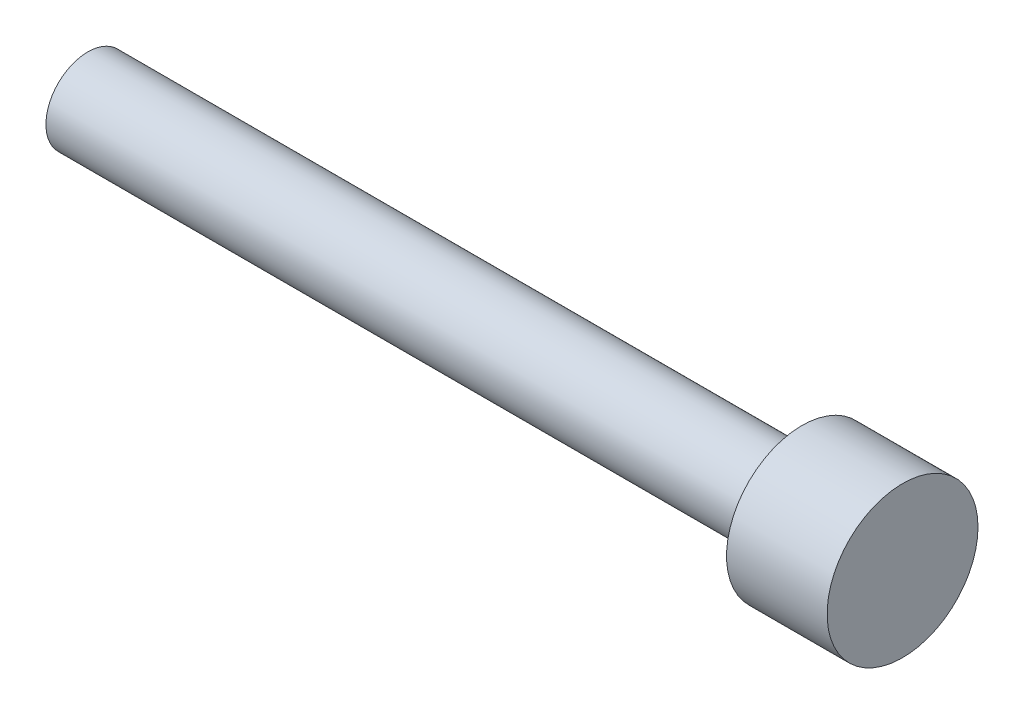
ISO-10303-21;
HEADER;
FILE_DESCRIPTION(('STEP AP214'),'2;1');
FILE_NAME('part.step','',(''),(''),'','','');
FILE_SCHEMA(('AUTOMOTIVE_DESIGN { 1 0 10303 214 1 1 1 1 }'));
ENDSEC;
DATA;
#1=APPLICATION_CONTEXT('core data for automotive mechanical design processes');
#2=APPLICATION_PROTOCOL_DEFINITION('international standard','automotive_design',2000,#1);
#3=PRODUCT_CONTEXT('',#1,'mechanical');
#4=PRODUCT('Part','Part','',(#3));
#5=PRODUCT_RELATED_PRODUCT_CATEGORY('part','',(#4));
#6=PRODUCT_DEFINITION_FORMATION('','',#4);
#7=PRODUCT_DEFINITION_CONTEXT('part definition',#1,'design');
#8=PRODUCT_DEFINITION('design','',#6,#7);
#9=PRODUCT_DEFINITION_SHAPE('','',#8);
#10=(LENGTH_UNIT() NAMED_UNIT(*) SI_UNIT(.MILLI.,.METRE.));
#11=(NAMED_UNIT(*) PLANE_ANGLE_UNIT() SI_UNIT($,.RADIAN.));
#12=(NAMED_UNIT(*) SI_UNIT($,.STERADIAN.) SOLID_ANGLE_UNIT());
#13=UNCERTAINTY_MEASURE_WITH_UNIT(LENGTH_MEASURE(1.E-05),#10,'distance_accuracy_value','');
#14=(GEOMETRIC_REPRESENTATION_CONTEXT(3) GLOBAL_UNCERTAINTY_ASSIGNED_CONTEXT((#13)) GLOBAL_UNIT_ASSIGNED_CONTEXT((#10,
#11,#12)) REPRESENTATION_CONTEXT('',''));
#15=CARTESIAN_POINT('',(0.,0.,0.));
#16=DIRECTION('',(0.,0.,1.));
#17=DIRECTION('',(1.,0.,0.));
#18=AXIS2_PLACEMENT_3D('',#15,#16,#17);
#19=CARTESIAN_POINT('',(10.65,0.,0.));
#20=DIRECTION('',(-1.,0.,0.));
#21=DIRECTION('',(0.,0.,1.));
#22=AXIS2_PLACEMENT_3D('',#19,#20,#21);
#23=CYLINDRICAL_SURFACE('',#22,1.25);
#24=CARTESIAN_POINT('',(10.65,0.,0.));
#25=DIRECTION('',(1.,0.,0.));
#26=DIRECTION('',(0.,0.,-1.));
#27=AXIS2_PLACEMENT_3D('',#24,#25,#26);
#28=CIRCLE('',#27,1.25);
#29=CARTESIAN_POINT('',(10.65,0.,-1.25));
#30=VERTEX_POINT('',#29);
#31=EDGE_CURVE('E10',#30,#30,#28,.T.);
#32=ORIENTED_EDGE('',*,*,#31,.F.);
#33=EDGE_LOOP('',(#32));
#34=FACE_BOUND('',#33,.T.);
#35=CARTESIAN_POINT('',(-10.65,0.,0.));
#36=DIRECTION('',(1.,0.,0.));
#37=DIRECTION('',(0.,0.,-1.));
#38=AXIS2_PLACEMENT_3D('',#35,#36,#37);
#39=CIRCLE('',#38,1.25);
#40=CARTESIAN_POINT('',(-10.65,0.,-1.25));
#41=VERTEX_POINT('',#40);
#42=EDGE_CURVE('E33',#41,#41,#39,.T.);
#43=ORIENTED_EDGE('',*,*,#42,.T.);
#44=EDGE_LOOP('',(#43));
#45=FACE_BOUND('',#44,.T.);
#46=ADVANCED_FACE('F30',(#34,#45),#23,.T.);
#47=CARTESIAN_POINT('',(-10.65,0.,0.));
#48=DIRECTION('',(1.,0.,0.));
#49=DIRECTION('',(0.,0.,-1.));
#50=AXIS2_PLACEMENT_3D('',#47,#48,#49);
#51=PLANE('',#50);
#52=ORIENTED_EDGE('',*,*,#42,.F.);
#53=EDGE_LOOP('',(#52));
#54=FACE_BOUND('',#53,.T.);
#55=ADVANCED_FACE('F53',(#54),#51,.F.);
#56=CARTESIAN_POINT('',(13.65,0.,0.));
#57=DIRECTION('',(-1.,0.,0.));
#58=DIRECTION('',(0.,0.,1.));
#59=AXIS2_PLACEMENT_3D('',#56,#57,#58);
#60=CYLINDRICAL_SURFACE('',#59,2.25);
#61=CARTESIAN_POINT('',(13.65,0.,0.));
#62=DIRECTION('',(1.,0.,0.));
#63=DIRECTION('',(0.,0.,-1.));
#64=AXIS2_PLACEMENT_3D('',#61,#62,#63);
#65=CIRCLE('',#64,2.25);
#66=CARTESIAN_POINT('',(13.65,0.,-2.25));
#67=VERTEX_POINT('',#66);
#68=EDGE_CURVE('E40',#67,#67,#65,.T.);
#69=ORIENTED_EDGE('',*,*,#68,.F.);
#70=EDGE_LOOP('',(#69));
#71=FACE_BOUND('',#70,.T.);
#72=CARTESIAN_POINT('',(10.65,0.,0.));
#73=DIRECTION('',(1.,0.,0.));
#74=DIRECTION('',(0.,0.,-1.));
#75=AXIS2_PLACEMENT_3D('',#72,#73,#74);
#76=CIRCLE('',#75,2.25);
#77=CARTESIAN_POINT('',(10.65,0.,-2.25));
#78=VERTEX_POINT('',#77);
#79=EDGE_CURVE('E42',#78,#78,#76,.T.);
#80=ORIENTED_EDGE('',*,*,#79,.T.);
#81=EDGE_LOOP('',(#80));
#82=FACE_BOUND('',#81,.T.);
#83=ADVANCED_FACE('F50',(#71,#82),#60,.T.);
#84=CARTESIAN_POINT('',(13.65,0.,0.));
#85=DIRECTION('',(1.,0.,0.));
#86=DIRECTION('',(0.,0.,-1.));
#87=AXIS2_PLACEMENT_3D('',#84,#85,#86);
#88=PLANE('',#87);
#89=ORIENTED_EDGE('',*,*,#68,.T.);
#90=EDGE_LOOP('',(#89));
#91=FACE_BOUND('',#90,.T.);
#92=ADVANCED_FACE('F48',(#91),#88,.T.);
#93=CARTESIAN_POINT('',(10.65,0.,0.));
#94=DIRECTION('',(1.,0.,0.));
#95=DIRECTION('',(0.,0.,-1.));
#96=AXIS2_PLACEMENT_3D('',#93,#94,#95);
#97=PLANE('',#96);
#98=ORIENTED_EDGE('',*,*,#31,.T.);
#99=EDGE_LOOP('',(#98));
#100=FACE_BOUND('',#99,.T.);
#101=ORIENTED_EDGE('',*,*,#79,.F.);
#102=EDGE_LOOP('',(#101));
#103=FACE_BOUND('',#102,.T.);
#104=ADVANCED_FACE('F57',(#100,#103),#97,.F.);
#105=CLOSED_SHELL('',(#46,#55,#83,#92,#104));
#106=MANIFOLD_SOLID_BREP('B2',#105);
#107=ADVANCED_BREP_SHAPE_REPRESENTATION('',(#18,#106),#14);
#108=SHAPE_DEFINITION_REPRESENTATION(#9,#107);
ENDSEC;
END-ISO-10303-21;
